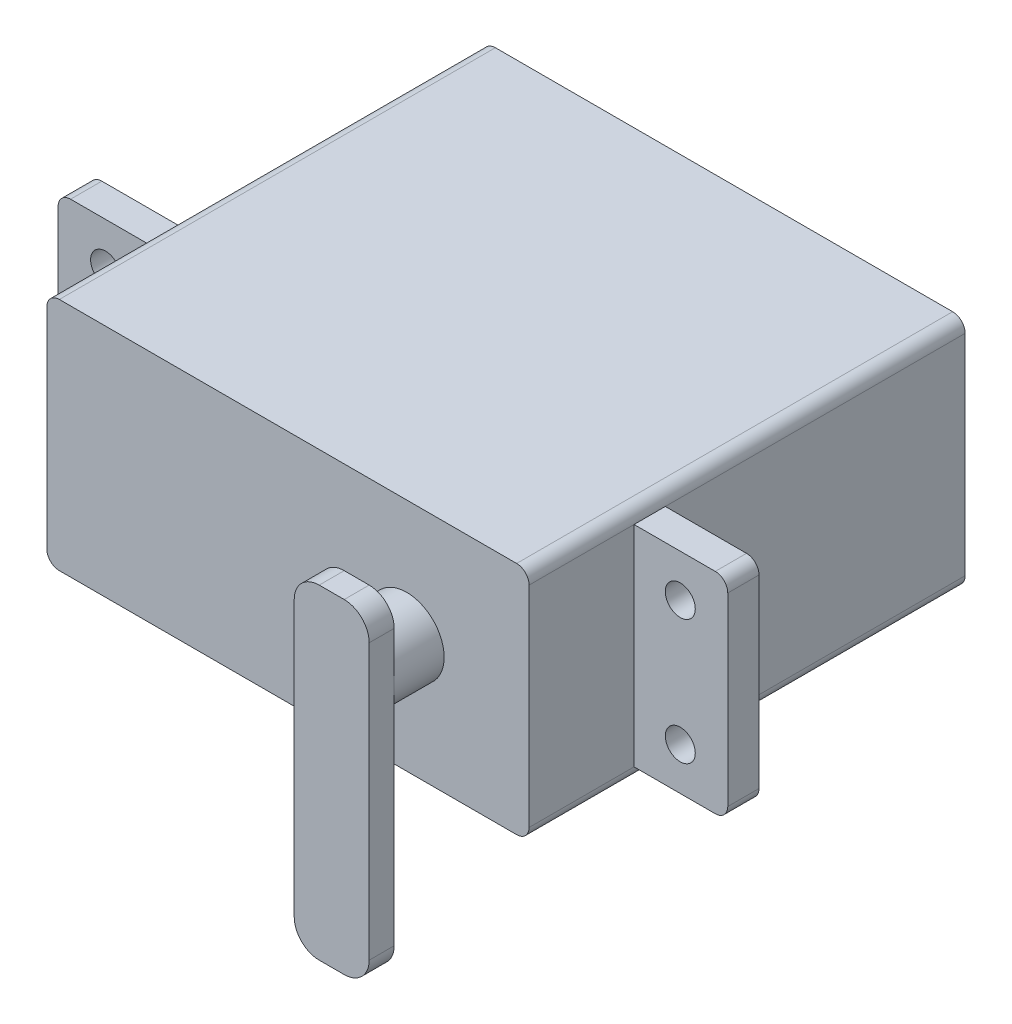
ISO-10303-21;
HEADER;
FILE_DESCRIPTION(('STEP AP214'),'2;1');
FILE_NAME('part.step','',(''),(''),'','','');
FILE_SCHEMA(('AUTOMOTIVE_DESIGN { 1 0 10303 214 1 1 1 1 }'));
ENDSEC;
DATA;
#1=APPLICATION_CONTEXT('core data for automotive mechanical design processes');
#2=APPLICATION_PROTOCOL_DEFINITION('international standard','automotive_design',2000,#1);
#3=PRODUCT_CONTEXT('',#1,'mechanical');
#4=PRODUCT('Part','Part','',(#3));
#5=PRODUCT_RELATED_PRODUCT_CATEGORY('part','',(#4));
#6=PRODUCT_DEFINITION_FORMATION('','',#4);
#7=PRODUCT_DEFINITION_CONTEXT('part definition',#1,'design');
#8=PRODUCT_DEFINITION('design','',#6,#7);
#9=PRODUCT_DEFINITION_SHAPE('','',#8);
#10=(LENGTH_UNIT() NAMED_UNIT(*) SI_UNIT(.MILLI.,.METRE.));
#11=(NAMED_UNIT(*) PLANE_ANGLE_UNIT() SI_UNIT($,.RADIAN.));
#12=(NAMED_UNIT(*) SI_UNIT($,.STERADIAN.) SOLID_ANGLE_UNIT());
#13=UNCERTAINTY_MEASURE_WITH_UNIT(LENGTH_MEASURE(1.E-05),#10,'distance_accuracy_value','');
#14=(GEOMETRIC_REPRESENTATION_CONTEXT(3) GLOBAL_UNCERTAINTY_ASSIGNED_CONTEXT((#13)) GLOBAL_UNIT_ASSIGNED_CONTEXT((#10,
#11,#12)) REPRESENTATION_CONTEXT('',''));
#15=CARTESIAN_POINT('',(0.,0.,0.));
#16=DIRECTION('',(0.,0.,1.));
#17=DIRECTION('',(1.,0.,0.));
#18=AXIS2_PLACEMENT_3D('',#15,#16,#17);
#19=CARTESIAN_POINT('',(19.3,-8.4,34.9));
#20=DIRECTION('',(-1.,0.,0.));
#21=DIRECTION('',(0.,0.,1.));
#22=AXIS2_PLACEMENT_3D('',#19,#20,#21);
#23=PLANE('',#22);
#24=DIRECTION('',(0.,1.,0.));
#25=VECTOR('',#24,1.);
#26=CARTESIAN_POINT('',(19.3,-8.4,24.));
#27=LINE('',#26,#25);
#28=CARTESIAN_POINT('',(19.3,-8.4,24.));
#29=VERTEX_POINT('',#28);
#30=CARTESIAN_POINT('',(19.3,8.4,24.));
#31=VERTEX_POINT('',#30);
#32=EDGE_CURVE('E352',#29,#31,#27,.T.);
#33=ORIENTED_EDGE('',*,*,#32,.F.);
#34=DIRECTION('',(0.,0.,-1.));
#35=VECTOR('',#34,1.);
#36=CARTESIAN_POINT('',(19.3,-8.4,34.9));
#37=LINE('',#36,#35);
#38=CARTESIAN_POINT('',(19.3,-8.4,0.));
#39=VERTEX_POINT('',#38);
#40=EDGE_CURVE('E419',#29,#39,#37,.T.);
#41=ORIENTED_EDGE('',*,*,#40,.T.);
#42=DIRECTION('',(0.,1.,0.));
#43=VECTOR('',#42,1.);
#44=CARTESIAN_POINT('',(19.3,-8.4,0.));
#45=LINE('',#44,#43);
#46=CARTESIAN_POINT('',(19.3,8.4,0.));
#47=VERTEX_POINT('',#46);
#48=EDGE_CURVE('E388',#39,#47,#45,.T.);
#49=ORIENTED_EDGE('',*,*,#48,.T.);
#50=DIRECTION('',(0.,0.,-1.));
#51=VECTOR('',#50,1.);
#52=CARTESIAN_POINT('',(19.3,8.4,34.9));
#53=LINE('',#52,#51);
#54=EDGE_CURVE('E415',#31,#47,#53,.T.);
#55=ORIENTED_EDGE('',*,*,#54,.F.);
#56=EDGE_LOOP('',(#33,#41,#49,#55));
#57=FACE_BOUND('',#56,.T.);
#58=ADVANCED_FACE('F39',(#57),#23,.F.);
#59=CARTESIAN_POINT('',(-19.3,8.4,34.9));
#60=DIRECTION('',(1.,0.,0.));
#61=DIRECTION('',(0.,0.,-1.));
#62=AXIS2_PLACEMENT_3D('',#59,#60,#61);
#63=PLANE('',#62);
#64=DIRECTION('',(0.,-1.,0.));
#65=VECTOR('',#64,1.);
#66=CARTESIAN_POINT('',(-19.3,8.4,24.));
#67=LINE('',#66,#65);
#68=CARTESIAN_POINT('',(-19.3,8.4,24.));
#69=VERTEX_POINT('',#68);
#70=CARTESIAN_POINT('',(-19.3,-8.4,24.));
#71=VERTEX_POINT('',#70);
#72=EDGE_CURVE('E47',#69,#71,#67,.T.);
#73=ORIENTED_EDGE('',*,*,#72,.F.);
#74=DIRECTION('',(0.,0.,-1.));
#75=VECTOR('',#74,1.);
#76=CARTESIAN_POINT('',(-19.3,8.4,34.9));
#77=LINE('',#76,#75);
#78=CARTESIAN_POINT('',(-19.3,8.4,0.));
#79=VERTEX_POINT('',#78);
#80=EDGE_CURVE('E403',#69,#79,#77,.T.);
#81=ORIENTED_EDGE('',*,*,#80,.T.);
#82=DIRECTION('',(0.,-1.,0.));
#83=VECTOR('',#82,1.);
#84=CARTESIAN_POINT('',(-19.3,8.4,0.));
#85=LINE('',#84,#83);
#86=CARTESIAN_POINT('',(-19.3,-8.4,0.));
#87=VERTEX_POINT('',#86);
#88=EDGE_CURVE('E366',#79,#87,#85,.T.);
#89=ORIENTED_EDGE('',*,*,#88,.T.);
#90=DIRECTION('',(0.,0.,-1.));
#91=VECTOR('',#90,1.);
#92=CARTESIAN_POINT('',(-19.3,-8.4,34.9));
#93=LINE('',#92,#91);
#94=EDGE_CURVE('E380',#71,#87,#93,.T.);
#95=ORIENTED_EDGE('',*,*,#94,.F.);
#96=EDGE_LOOP('',(#73,#81,#89,#95));
#97=FACE_BOUND('',#96,.T.);
#98=ADVANCED_FACE('F460',(#97),#63,.F.);
#99=CARTESIAN_POINT('',(-18.3,-8.4,34.9));
#100=DIRECTION('',(0.,0.,-1.));
#101=DIRECTION('',(-1.,0.,0.));
#102=AXIS2_PLACEMENT_3D('',#99,#100,#101);
#103=CYLINDRICAL_SURFACE('',#102,1.);
#104=CARTESIAN_POINT('',(-18.3,-8.4,0.));
#105=DIRECTION('',(0.,0.,1.));
#106=DIRECTION('',(1.,0.,0.));
#107=AXIS2_PLACEMENT_3D('',#104,#105,#106);
#108=CIRCLE('',#107,1.);
#109=CARTESIAN_POINT('',(-18.3,-9.4,0.));
#110=VERTEX_POINT('',#109);
#111=EDGE_CURVE('E361',#87,#110,#108,.T.);
#112=ORIENTED_EDGE('',*,*,#111,.T.);
#113=DIRECTION('',(0.,0.,-1.));
#114=VECTOR('',#113,1.);
#115=CARTESIAN_POINT('',(-18.3,-9.4,34.9));
#116=LINE('',#115,#114);
#117=CARTESIAN_POINT('',(-18.3,-9.4,34.9));
#118=VERTEX_POINT('',#117);
#119=EDGE_CURVE('E426',#118,#110,#116,.T.);
#120=ORIENTED_EDGE('',*,*,#119,.F.);
#121=CARTESIAN_POINT('',(-18.3,-8.4,34.9));
#122=DIRECTION('',(0.,0.,1.));
#123=DIRECTION('',(1.,0.,0.));
#124=AXIS2_PLACEMENT_3D('',#121,#122,#123);
#125=CIRCLE('',#124,1.);
#126=CARTESIAN_POINT('',(-19.3,-8.4,34.9));
#127=VERTEX_POINT('',#126);
#128=EDGE_CURVE('E362',#127,#118,#125,.T.);
#129=ORIENTED_EDGE('',*,*,#128,.F.);
#130=CARTESIAN_POINT('',(-19.3,-8.4,26.5));
#131=VERTEX_POINT('',#130);
#132=EDGE_CURVE('E400',#127,#131,#93,.T.);
#133=ORIENTED_EDGE('',*,*,#132,.T.);
#134=EDGE_CURVE('E404',#131,#71,#93,.T.);
#135=ORIENTED_EDGE('',*,*,#134,.T.);
#136=ORIENTED_EDGE('',*,*,#94,.T.);
#137=EDGE_LOOP('',(#112,#120,#129,#133,#135,#136));
#138=FACE_BOUND('',#137,.T.);
#139=ADVANCED_FACE('F41',(#138),#103,.T.);
#140=CARTESIAN_POINT('',(-18.3,-9.4,34.9));
#141=DIRECTION('',(0.,1.,0.));
#142=DIRECTION('',(0.,0.,1.));
#143=AXIS2_PLACEMENT_3D('',#140,#141,#142);
#144=PLANE('',#143);
#145=DIRECTION('',(1.,0.,0.));
#146=VECTOR('',#145,1.);
#147=CARTESIAN_POINT('',(-18.3,-9.4,0.));
#148=LINE('',#147,#146);
#149=CARTESIAN_POINT('',(18.3,-9.4,0.));
#150=VERTEX_POINT('',#149);
#151=EDGE_CURVE('E383',#110,#150,#148,.T.);
#152=ORIENTED_EDGE('',*,*,#151,.T.);
#153=DIRECTION('',(0.,0.,-1.));
#154=VECTOR('',#153,1.);
#155=CARTESIAN_POINT('',(18.3,-9.4,34.9));
#156=LINE('',#155,#154);
#157=CARTESIAN_POINT('',(18.3,-9.4,34.9));
#158=VERTEX_POINT('',#157);
#159=EDGE_CURVE('E423',#158,#150,#156,.T.);
#160=ORIENTED_EDGE('',*,*,#159,.F.);
#161=DIRECTION('',(1.,0.,0.));
#162=VECTOR('',#161,1.);
#163=CARTESIAN_POINT('',(-18.3,-9.4,34.9));
#164=LINE('',#163,#162);
#165=EDGE_CURVE('E365',#118,#158,#164,.T.);
#166=ORIENTED_EDGE('',*,*,#165,.F.);
#167=ORIENTED_EDGE('',*,*,#119,.T.);
#168=EDGE_LOOP('',(#152,#160,#166,#167));
#169=FACE_BOUND('',#168,.T.);
#170=ADVANCED_FACE('F521',(#169),#144,.F.);
#171=CARTESIAN_POINT('',(18.3,-8.4,34.9));
#172=DIRECTION('',(0.,0.,-1.));
#173=DIRECTION('',(-1.,0.,0.));
#174=AXIS2_PLACEMENT_3D('',#171,#172,#173);
#175=CYLINDRICAL_SURFACE('',#174,1.);
#176=CARTESIAN_POINT('',(18.3,-8.4,0.));
#177=DIRECTION('',(0.,0.,1.));
#178=DIRECTION('',(1.,0.,0.));
#179=AXIS2_PLACEMENT_3D('',#176,#177,#178);
#180=CIRCLE('',#179,1.);
#181=EDGE_CURVE('E385',#150,#39,#180,.T.);
#182=ORIENTED_EDGE('',*,*,#181,.T.);
#183=ORIENTED_EDGE('',*,*,#40,.F.);
#184=DIRECTION('',(0.,0.,-1.));
#185=VECTOR('',#184,1.);
#186=CARTESIAN_POINT('',(19.3,-8.4,34.9));
#187=LINE('',#186,#185);
#188=CARTESIAN_POINT('',(19.3,-8.4,26.5));
#189=VERTEX_POINT('',#188);
#190=EDGE_CURVE('E359',#189,#29,#187,.T.);
#191=ORIENTED_EDGE('',*,*,#190,.F.);
#192=CARTESIAN_POINT('',(19.3,-8.4,34.9));
#193=VERTEX_POINT('',#192);
#194=EDGE_CURVE('E420',#193,#189,#37,.T.);
#195=ORIENTED_EDGE('',*,*,#194,.F.);
#196=CARTESIAN_POINT('',(18.3,-8.4,34.9));
#197=DIRECTION('',(0.,0.,1.));
#198=DIRECTION('',(1.,0.,0.));
#199=AXIS2_PLACEMENT_3D('',#196,#197,#198);
#200=CIRCLE('',#199,1.);
#201=EDGE_CURVE('E368',#158,#193,#200,.T.);
#202=ORIENTED_EDGE('',*,*,#201,.F.);
#203=ORIENTED_EDGE('',*,*,#159,.T.);
#204=EDGE_LOOP('',(#182,#183,#191,#195,#202,#203));
#205=FACE_BOUND('',#204,.T.);
#206=ADVANCED_FACE('F513',(#205),#175,.T.);
#207=ORIENTED_EDGE('',*,*,#194,.T.);
#208=DIRECTION('',(0.,1.,0.));
#209=VECTOR('',#208,1.);
#210=CARTESIAN_POINT('',(19.3,-8.4,26.5));
#211=LINE('',#210,#209);
#212=CARTESIAN_POINT('',(19.3,8.4,26.5));
#213=VERTEX_POINT('',#212);
#214=EDGE_CURVE('E354',#189,#213,#211,.T.);
#215=ORIENTED_EDGE('',*,*,#214,.T.);
#216=CARTESIAN_POINT('',(19.3,8.4,34.9));
#217=VERTEX_POINT('',#216);
#218=EDGE_CURVE('E416',#217,#213,#53,.T.);
#219=ORIENTED_EDGE('',*,*,#218,.F.);
#220=DIRECTION('',(0.,1.,0.));
#221=VECTOR('',#220,1.);
#222=CARTESIAN_POINT('',(19.3,-8.4,34.9));
#223=LINE('',#222,#221);
#224=EDGE_CURVE('E370',#193,#217,#223,.T.);
#225=ORIENTED_EDGE('',*,*,#224,.F.);
#226=EDGE_LOOP('',(#207,#215,#219,#225));
#227=FACE_BOUND('',#226,.T.);
#228=ADVANCED_FACE('F502',(#227),#23,.F.);
#229=CARTESIAN_POINT('',(18.3,8.4,34.9));
#230=DIRECTION('',(0.,0.,-1.));
#231=DIRECTION('',(-1.,0.,0.));
#232=AXIS2_PLACEMENT_3D('',#229,#230,#231);
#233=CYLINDRICAL_SURFACE('',#232,1.);
#234=CARTESIAN_POINT('',(18.3,8.4,0.));
#235=DIRECTION('',(0.,0.,1.));
#236=DIRECTION('',(1.,0.,0.));
#237=AXIS2_PLACEMENT_3D('',#234,#235,#236);
#238=CIRCLE('',#237,1.);
#239=CARTESIAN_POINT('',(18.3,9.4,0.));
#240=VERTEX_POINT('',#239);
#241=EDGE_CURVE('E391',#47,#240,#238,.T.);
#242=ORIENTED_EDGE('',*,*,#241,.T.);
#243=DIRECTION('',(0.,0.,-1.));
#244=VECTOR('',#243,1.);
#245=CARTESIAN_POINT('',(18.3,9.4,34.9));
#246=LINE('',#245,#244);
#247=CARTESIAN_POINT('',(18.3,9.4,34.9));
#248=VERTEX_POINT('',#247);
#249=EDGE_CURVE('E412',#248,#240,#246,.T.);
#250=ORIENTED_EDGE('',*,*,#249,.F.);
#251=CARTESIAN_POINT('',(18.3,8.4,34.9));
#252=DIRECTION('',(0.,0.,1.));
#253=DIRECTION('',(1.,0.,0.));
#254=AXIS2_PLACEMENT_3D('',#251,#252,#253);
#255=CIRCLE('',#254,1.);
#256=EDGE_CURVE('E372',#217,#248,#255,.T.);
#257=ORIENTED_EDGE('',*,*,#256,.F.);
#258=ORIENTED_EDGE('',*,*,#218,.T.);
#259=DIRECTION('',(0.,0.,-1.));
#260=VECTOR('',#259,1.);
#261=CARTESIAN_POINT('',(19.3,8.4,34.9));
#262=LINE('',#261,#260);
#263=EDGE_CURVE('E357',#31,#213,#262,.F.);
#264=ORIENTED_EDGE('',*,*,#263,.F.);
#265=ORIENTED_EDGE('',*,*,#54,.T.);
#266=EDGE_LOOP('',(#242,#250,#257,#258,#264,#265));
#267=FACE_BOUND('',#266,.T.);
#268=ADVANCED_FACE('F512',(#267),#233,.T.);
#269=CARTESIAN_POINT('',(18.3,9.4,34.9));
#270=DIRECTION('',(0.,-1.,0.));
#271=DIRECTION('',(0.,0.,-1.));
#272=AXIS2_PLACEMENT_3D('',#269,#270,#271);
#273=PLANE('',#272);
#274=DIRECTION('',(-1.,0.,0.));
#275=VECTOR('',#274,1.);
#276=CARTESIAN_POINT('',(18.3,9.4,0.));
#277=LINE('',#276,#275);
#278=CARTESIAN_POINT('',(-18.3,9.4,0.));
#279=VERTEX_POINT('',#278);
#280=EDGE_CURVE('E393',#240,#279,#277,.T.);
#281=ORIENTED_EDGE('',*,*,#280,.T.);
#282=DIRECTION('',(0.,0.,-1.));
#283=VECTOR('',#282,1.);
#284=CARTESIAN_POINT('',(-18.3,9.4,34.9));
#285=LINE('',#284,#283);
#286=CARTESIAN_POINT('',(-18.3,9.4,34.9));
#287=VERTEX_POINT('',#286);
#288=EDGE_CURVE('E408',#287,#279,#285,.T.);
#289=ORIENTED_EDGE('',*,*,#288,.F.);
#290=DIRECTION('',(-1.,0.,0.));
#291=VECTOR('',#290,1.);
#292=CARTESIAN_POINT('',(18.3,9.4,34.9));
#293=LINE('',#292,#291);
#294=EDGE_CURVE('E374',#248,#287,#293,.T.);
#295=ORIENTED_EDGE('',*,*,#294,.F.);
#296=ORIENTED_EDGE('',*,*,#249,.T.);
#297=EDGE_LOOP('',(#281,#289,#295,#296));
#298=FACE_BOUND('',#297,.T.);
#299=ADVANCED_FACE('F519',(#298),#273,.F.);
#300=CARTESIAN_POINT('',(-18.3,8.4,34.9));
#301=DIRECTION('',(0.,0.,-1.));
#302=DIRECTION('',(-1.,0.,0.));
#303=AXIS2_PLACEMENT_3D('',#300,#301,#302);
#304=CYLINDRICAL_SURFACE('',#303,1.);
#305=CARTESIAN_POINT('',(-18.3,8.4,0.));
#306=DIRECTION('',(0.,0.,1.));
#307=DIRECTION('',(1.,0.,0.));
#308=AXIS2_PLACEMENT_3D('',#305,#306,#307);
#309=CIRCLE('',#308,1.);
#310=EDGE_CURVE('E395',#279,#79,#309,.T.);
#311=ORIENTED_EDGE('',*,*,#310,.T.);
#312=ORIENTED_EDGE('',*,*,#80,.F.);
#313=CARTESIAN_POINT('',(-19.3,8.4,26.5));
#314=VERTEX_POINT('',#313);
#315=EDGE_CURVE('E409',#314,#69,#77,.T.);
#316=ORIENTED_EDGE('',*,*,#315,.F.);
#317=CARTESIAN_POINT('',(-19.3,8.4,34.9));
#318=VERTEX_POINT('',#317);
#319=EDGE_CURVE('E405',#318,#314,#77,.T.);
#320=ORIENTED_EDGE('',*,*,#319,.F.);
#321=CARTESIAN_POINT('',(-18.3,8.4,34.9));
#322=DIRECTION('',(0.,0.,1.));
#323=DIRECTION('',(1.,0.,0.));
#324=AXIS2_PLACEMENT_3D('',#321,#322,#323);
#325=CIRCLE('',#324,1.);
#326=EDGE_CURVE('E376',#287,#318,#325,.T.);
#327=ORIENTED_EDGE('',*,*,#326,.F.);
#328=ORIENTED_EDGE('',*,*,#288,.T.);
#329=EDGE_LOOP('',(#311,#312,#316,#320,#327,#328));
#330=FACE_BOUND('',#329,.T.);
#331=ADVANCED_FACE('F464',(#330),#304,.T.);
#332=ORIENTED_EDGE('',*,*,#319,.T.);
#333=DIRECTION('',(0.,-1.,0.));
#334=VECTOR('',#333,1.);
#335=CARTESIAN_POINT('',(-19.3,8.4,26.5));
#336=LINE('',#335,#334);
#337=EDGE_CURVE('E11',#314,#131,#336,.T.);
#338=ORIENTED_EDGE('',*,*,#337,.T.);
#339=ORIENTED_EDGE('',*,*,#132,.F.);
#340=DIRECTION('',(0.,-1.,0.));
#341=VECTOR('',#340,1.);
#342=CARTESIAN_POINT('',(-19.3,8.4,34.9));
#343=LINE('',#342,#341);
#344=EDGE_CURVE('E378',#318,#127,#343,.T.);
#345=ORIENTED_EDGE('',*,*,#344,.F.);
#346=EDGE_LOOP('',(#332,#338,#339,#345));
#347=FACE_BOUND('',#346,.T.);
#348=ADVANCED_FACE('F477',(#347),#63,.F.);
#349=CARTESIAN_POINT('',(-18.3,-8.4,34.9));
#350=DIRECTION('',(0.,0.,1.));
#351=DIRECTION('',(1.,0.,0.));
#352=AXIS2_PLACEMENT_3D('',#349,#350,#351);
#353=PLANE('',#352);
#354=CARTESIAN_POINT('',(9.5,0.,34.9));
#355=DIRECTION('',(0.,0.,1.));
#356=DIRECTION('',(1.,0.,0.));
#357=AXIS2_PLACEMENT_3D('',#354,#355,#356);
#358=CIRCLE('',#357,3.);
#359=CARTESIAN_POINT('',(12.5,0.,34.9));
#360=VERTEX_POINT('',#359);
#361=EDGE_CURVE('E255',#360,#360,#358,.T.);
#362=ORIENTED_EDGE('',*,*,#361,.F.);
#363=EDGE_LOOP('',(#362));
#364=FACE_BOUND('',#363,.T.);
#365=ORIENTED_EDGE('',*,*,#128,.T.);
#366=ORIENTED_EDGE('',*,*,#165,.T.);
#367=ORIENTED_EDGE('',*,*,#201,.T.);
#368=ORIENTED_EDGE('',*,*,#224,.T.);
#369=ORIENTED_EDGE('',*,*,#256,.T.);
#370=ORIENTED_EDGE('',*,*,#294,.T.);
#371=ORIENTED_EDGE('',*,*,#326,.T.);
#372=ORIENTED_EDGE('',*,*,#344,.T.);
#373=EDGE_LOOP('',(#365,#366,#367,#368,#369,#370,#371,#372));
#374=FACE_BOUND('',#373,.T.);
#375=ADVANCED_FACE('F572',(#364,#374),#353,.T.);
#376=CARTESIAN_POINT('',(-18.3,-8.4,0.));
#377=DIRECTION('',(0.,0.,1.));
#378=DIRECTION('',(1.,0.,0.));
#379=AXIS2_PLACEMENT_3D('',#376,#377,#378);
#380=PLANE('',#379);
#381=ORIENTED_EDGE('',*,*,#111,.F.);
#382=ORIENTED_EDGE('',*,*,#88,.F.);
#383=ORIENTED_EDGE('',*,*,#310,.F.);
#384=ORIENTED_EDGE('',*,*,#280,.F.);
#385=ORIENTED_EDGE('',*,*,#241,.F.);
#386=ORIENTED_EDGE('',*,*,#48,.F.);
#387=ORIENTED_EDGE('',*,*,#181,.F.);
#388=ORIENTED_EDGE('',*,*,#151,.F.);
#389=EDGE_LOOP('',(#381,#382,#383,#384,#385,#386,#387,#388));
#390=FACE_BOUND('',#389,.T.);
#391=ADVANCED_FACE('F469',(#390),#380,.F.);
#392=CARTESIAN_POINT('',(-25.8,7.4,26.5));
#393=DIRECTION('',(0.,0.,-1.));
#394=DIRECTION('',(-1.,0.,0.));
#395=AXIS2_PLACEMENT_3D('',#392,#393,#394);
#396=CYLINDRICAL_SURFACE('',#395,1.);
#397=CARTESIAN_POINT('',(-25.8,7.4,24.));
#398=DIRECTION('',(0.,0.,1.));
#399=DIRECTION('',(1.,0.,0.));
#400=AXIS2_PLACEMENT_3D('',#397,#398,#399);
#401=CIRCLE('',#400,1.);
#402=CARTESIAN_POINT('',(-25.8,8.4,24.));
#403=VERTEX_POINT('',#402);
#404=CARTESIAN_POINT('',(-26.8,7.4,24.));
#405=VERTEX_POINT('',#404);
#406=EDGE_CURVE('E327',#403,#405,#401,.T.);
#407=ORIENTED_EDGE('',*,*,#406,.T.);
#408=DIRECTION('',(0.,0.,-1.));
#409=VECTOR('',#408,1.);
#410=CARTESIAN_POINT('',(-26.8,7.4,26.5));
#411=LINE('',#410,#409);
#412=CARTESIAN_POINT('',(-26.8,7.4,26.5));
#413=VERTEX_POINT('',#412);
#414=EDGE_CURVE('E332',#413,#405,#411,.T.);
#415=ORIENTED_EDGE('',*,*,#414,.F.);
#416=CARTESIAN_POINT('',(-25.8,7.4,26.5));
#417=DIRECTION('',(0.,0.,1.));
#418=DIRECTION('',(1.,0.,0.));
#419=AXIS2_PLACEMENT_3D('',#416,#417,#418);
#420=CIRCLE('',#419,1.);
#421=CARTESIAN_POINT('',(-25.8,8.4,26.5));
#422=VERTEX_POINT('',#421);
#423=EDGE_CURVE('E308',#422,#413,#420,.T.);
#424=ORIENTED_EDGE('',*,*,#423,.F.);
#425=DIRECTION('',(0.,0.,-1.));
#426=VECTOR('',#425,1.);
#427=CARTESIAN_POINT('',(-25.8,8.4,26.5));
#428=LINE('',#427,#426);
#429=EDGE_CURVE('E335',#422,#403,#428,.T.);
#430=ORIENTED_EDGE('',*,*,#429,.T.);
#431=EDGE_LOOP('',(#407,#415,#424,#430));
#432=FACE_BOUND('',#431,.T.);
#433=ADVANCED_FACE('F452',(#432),#396,.T.);
#434=CARTESIAN_POINT('',(-26.8,7.4,26.5));
#435=DIRECTION('',(1.,0.,0.));
#436=DIRECTION('',(0.,0.,-1.));
#437=AXIS2_PLACEMENT_3D('',#434,#435,#436);
#438=PLANE('',#437);
#439=DIRECTION('',(0.,-1.,0.));
#440=VECTOR('',#439,1.);
#441=CARTESIAN_POINT('',(-26.8,7.4,24.));
#442=LINE('',#441,#440);
#443=CARTESIAN_POINT('',(-26.8,-7.4,24.));
#444=VERTEX_POINT('',#443);
#445=EDGE_CURVE('E294',#405,#444,#442,.T.);
#446=ORIENTED_EDGE('',*,*,#445,.T.);
#447=DIRECTION('',(0.,0.,-1.));
#448=VECTOR('',#447,1.);
#449=CARTESIAN_POINT('',(-26.8,-7.4,26.5));
#450=LINE('',#449,#448);
#451=CARTESIAN_POINT('',(-26.8,-7.4,26.5));
#452=VERTEX_POINT('',#451);
#453=EDGE_CURVE('E312',#452,#444,#450,.T.);
#454=ORIENTED_EDGE('',*,*,#453,.F.);
#455=DIRECTION('',(0.,-1.,0.));
#456=VECTOR('',#455,1.);
#457=CARTESIAN_POINT('',(-26.8,7.4,26.5));
#458=LINE('',#457,#456);
#459=EDGE_CURVE('E310',#413,#452,#458,.T.);
#460=ORIENTED_EDGE('',*,*,#459,.F.);
#461=ORIENTED_EDGE('',*,*,#414,.T.);
#462=EDGE_LOOP('',(#446,#454,#460,#461));
#463=FACE_BOUND('',#462,.T.);
#464=ADVANCED_FACE('F447',(#463),#438,.F.);
#465=CARTESIAN_POINT('',(-25.8,-7.4,26.5));
#466=DIRECTION('',(0.,0.,-1.));
#467=DIRECTION('',(-1.,0.,0.));
#468=AXIS2_PLACEMENT_3D('',#465,#466,#467);
#469=CYLINDRICAL_SURFACE('',#468,1.);
#470=CARTESIAN_POINT('',(-25.8,-7.4,24.));
#471=DIRECTION('',(0.,0.,1.));
#472=DIRECTION('',(1.,0.,0.));
#473=AXIS2_PLACEMENT_3D('',#470,#471,#472);
#474=CIRCLE('',#473,1.);
#475=CARTESIAN_POINT('',(-25.8,-8.4,24.));
#476=VERTEX_POINT('',#475);
#477=EDGE_CURVE('E287',#444,#476,#474,.T.);
#478=ORIENTED_EDGE('',*,*,#477,.T.);
#479=DIRECTION('',(0.,0.,-1.));
#480=VECTOR('',#479,1.);
#481=CARTESIAN_POINT('',(-25.8,-8.4,26.5));
#482=LINE('',#481,#480);
#483=CARTESIAN_POINT('',(-25.8,-8.4,26.5));
#484=VERTEX_POINT('',#483);
#485=EDGE_CURVE('E349',#484,#476,#482,.T.);
#486=ORIENTED_EDGE('',*,*,#485,.F.);
#487=CARTESIAN_POINT('',(-25.8,-7.4,26.5));
#488=DIRECTION('',(0.,0.,1.));
#489=DIRECTION('',(1.,0.,0.));
#490=AXIS2_PLACEMENT_3D('',#487,#488,#489);
#491=CIRCLE('',#490,1.);
#492=EDGE_CURVE('E290',#452,#484,#491,.T.);
#493=ORIENTED_EDGE('',*,*,#492,.F.);
#494=ORIENTED_EDGE('',*,*,#453,.T.);
#495=EDGE_LOOP('',(#478,#486,#493,#494));
#496=FACE_BOUND('',#495,.T.);
#497=ADVANCED_FACE('F443',(#496),#469,.T.);
#498=CARTESIAN_POINT('',(-25.8,-7.4,24.));
#499=DIRECTION('',(0.,0.,1.));
#500=DIRECTION('',(1.,0.,0.));
#501=AXIS2_PLACEMENT_3D('',#498,#499,#500);
#502=PLANE('',#501);
#503=CARTESIAN_POINT('',(-23.,5.,24.));
#504=DIRECTION('',(0.,0.,1.));
#505=DIRECTION('',(1.,0.,0.));
#506=AXIS2_PLACEMENT_3D('',#503,#504,#505);
#507=CIRCLE('',#506,1.2);
#508=CARTESIAN_POINT('',(-21.8,5.,24.));
#509=VERTEX_POINT('',#508);
#510=EDGE_CURVE('E279',#509,#509,#507,.T.);
#511=ORIENTED_EDGE('',*,*,#510,.T.);
#512=EDGE_LOOP('',(#511));
#513=FACE_BOUND('',#512,.T.);
#514=CARTESIAN_POINT('',(-23.,-5.,24.));
#515=DIRECTION('',(0.,0.,1.));
#516=DIRECTION('',(1.,0.,0.));
#517=AXIS2_PLACEMENT_3D('',#514,#515,#516);
#518=CIRCLE('',#517,1.2);
#519=CARTESIAN_POINT('',(-21.8,-5.,24.));
#520=VERTEX_POINT('',#519);
#521=EDGE_CURVE('E266',#520,#520,#518,.T.);
#522=ORIENTED_EDGE('',*,*,#521,.T.);
#523=EDGE_LOOP('',(#522));
#524=FACE_BOUND('',#523,.T.);
#525=DIRECTION('',(-1.,0.,0.));
#526=VECTOR('',#525,1.);
#527=CARTESIAN_POINT('',(25.8,8.4,24.));
#528=LINE('',#527,#526);
#529=EDGE_CURVE('E325',#69,#403,#528,.T.);
#530=ORIENTED_EDGE('',*,*,#529,.F.);
#531=ORIENTED_EDGE('',*,*,#72,.T.);
#532=DIRECTION('',(1.,0.,0.));
#533=VECTOR('',#532,1.);
#534=CARTESIAN_POINT('',(-25.8,-8.4,24.));
#535=LINE('',#534,#533);
#536=EDGE_CURVE('E316',#476,#71,#535,.T.);
#537=ORIENTED_EDGE('',*,*,#536,.F.);
#538=ORIENTED_EDGE('',*,*,#477,.F.);
#539=ORIENTED_EDGE('',*,*,#445,.F.);
#540=ORIENTED_EDGE('',*,*,#406,.F.);
#541=EDGE_LOOP('',(#530,#531,#537,#538,#539,#540));
#542=FACE_BOUND('',#541,.T.);
#543=ADVANCED_FACE('F431',(#513,#524,#542),#502,.F.);
#544=CARTESIAN_POINT('',(-25.8,-7.4,26.5));
#545=DIRECTION('',(0.,0.,1.));
#546=DIRECTION('',(1.,0.,0.));
#547=AXIS2_PLACEMENT_3D('',#544,#545,#546);
#548=PLANE('',#547);
#549=CARTESIAN_POINT('',(-23.,5.,26.5));
#550=DIRECTION('',(0.,0.,1.));
#551=DIRECTION('',(1.,0.,0.));
#552=AXIS2_PLACEMENT_3D('',#549,#550,#551);
#553=CIRCLE('',#552,1.2);
#554=CARTESIAN_POINT('',(-21.8,5.,26.5));
#555=VERTEX_POINT('',#554);
#556=EDGE_CURVE('E269',#555,#555,#553,.T.);
#557=ORIENTED_EDGE('',*,*,#556,.F.);
#558=EDGE_LOOP('',(#557));
#559=FACE_BOUND('',#558,.T.);
#560=CARTESIAN_POINT('',(-23.,-5.,26.5));
#561=DIRECTION('',(0.,0.,1.));
#562=DIRECTION('',(1.,0.,0.));
#563=AXIS2_PLACEMENT_3D('',#560,#561,#562);
#564=CIRCLE('',#563,1.2);
#565=CARTESIAN_POINT('',(-21.8,-5.,26.5));
#566=VERTEX_POINT('',#565);
#567=EDGE_CURVE('E264',#566,#566,#564,.T.);
#568=ORIENTED_EDGE('',*,*,#567,.F.);
#569=EDGE_LOOP('',(#568));
#570=FACE_BOUND('',#569,.T.);
#571=ORIENTED_EDGE('',*,*,#337,.F.);
#572=DIRECTION('',(-1.,0.,0.));
#573=VECTOR('',#572,1.);
#574=CARTESIAN_POINT('',(25.8,8.4,26.5));
#575=LINE('',#574,#573);
#576=EDGE_CURVE('E304',#314,#422,#575,.T.);
#577=ORIENTED_EDGE('',*,*,#576,.T.);
#578=ORIENTED_EDGE('',*,*,#423,.T.);
#579=ORIENTED_EDGE('',*,*,#459,.T.);
#580=ORIENTED_EDGE('',*,*,#492,.T.);
#581=DIRECTION('',(1.,0.,0.));
#582=VECTOR('',#581,1.);
#583=CARTESIAN_POINT('',(-25.8,-8.4,26.5));
#584=LINE('',#583,#582);
#585=EDGE_CURVE('E295',#484,#131,#584,.T.);
#586=ORIENTED_EDGE('',*,*,#585,.T.);
#587=EDGE_LOOP('',(#571,#577,#578,#579,#580,#586));
#588=FACE_BOUND('',#587,.T.);
#589=ADVANCED_FACE('F480',(#559,#570,#588),#548,.T.);
#590=CARTESIAN_POINT('',(25.8,8.4,26.5));
#591=DIRECTION('',(0.,-1.,0.));
#592=DIRECTION('',(0.,0.,-1.));
#593=AXIS2_PLACEMENT_3D('',#590,#591,#592);
#594=PLANE('',#593);
#595=ORIENTED_EDGE('',*,*,#576,.F.);
#596=ORIENTED_EDGE('',*,*,#315,.T.);
#597=ORIENTED_EDGE('',*,*,#529,.T.);
#598=ORIENTED_EDGE('',*,*,#429,.F.);
#599=EDGE_LOOP('',(#595,#596,#597,#598));
#600=FACE_BOUND('',#599,.T.);
#601=ADVANCED_FACE('F456',(#600),#594,.F.);
#602=CARTESIAN_POINT('',(-25.8,-8.4,26.5));
#603=DIRECTION('',(0.,1.,0.));
#604=DIRECTION('',(0.,0.,1.));
#605=AXIS2_PLACEMENT_3D('',#602,#603,#604);
#606=PLANE('',#605);
#607=ORIENTED_EDGE('',*,*,#536,.T.);
#608=ORIENTED_EDGE('',*,*,#134,.F.);
#609=ORIENTED_EDGE('',*,*,#585,.F.);
#610=ORIENTED_EDGE('',*,*,#485,.T.);
#611=EDGE_LOOP('',(#607,#608,#609,#610));
#612=FACE_BOUND('',#611,.T.);
#613=ADVANCED_FACE('F439',(#612),#606,.F.);
#614=CARTESIAN_POINT('',(25.8,-8.4,26.5));
#615=VERTEX_POINT('',#614);
#616=EDGE_CURVE('E293',#189,#615,#584,.T.);
#617=ORIENTED_EDGE('',*,*,#616,.F.);
#618=ORIENTED_EDGE('',*,*,#190,.T.);
#619=CARTESIAN_POINT('',(25.8,-8.4,24.));
#620=VERTEX_POINT('',#619);
#621=EDGE_CURVE('E315',#29,#620,#535,.T.);
#622=ORIENTED_EDGE('',*,*,#621,.T.);
#623=DIRECTION('',(0.,0.,-1.));
#624=VECTOR('',#623,1.);
#625=CARTESIAN_POINT('',(25.8,-8.4,26.5));
#626=LINE('',#625,#624);
#627=EDGE_CURVE('E346',#615,#620,#626,.T.);
#628=ORIENTED_EDGE('',*,*,#627,.F.);
#629=EDGE_LOOP('',(#617,#618,#622,#628));
#630=FACE_BOUND('',#629,.T.);
#631=ADVANCED_FACE('F532',(#630),#606,.F.);
#632=CARTESIAN_POINT('',(25.8,8.4,24.));
#633=VERTEX_POINT('',#632);
#634=EDGE_CURVE('E61',#633,#31,#528,.T.);
#635=ORIENTED_EDGE('',*,*,#634,.T.);
#636=ORIENTED_EDGE('',*,*,#263,.T.);
#637=CARTESIAN_POINT('',(25.8,8.4,26.5));
#638=VERTEX_POINT('',#637);
#639=EDGE_CURVE('E305',#638,#213,#575,.T.);
#640=ORIENTED_EDGE('',*,*,#639,.F.);
#641=DIRECTION('',(0.,0.,-1.));
#642=VECTOR('',#641,1.);
#643=CARTESIAN_POINT('',(25.8,8.4,26.5));
#644=LINE('',#643,#642);
#645=EDGE_CURVE('E338',#638,#633,#644,.T.);
#646=ORIENTED_EDGE('',*,*,#645,.T.);
#647=EDGE_LOOP('',(#635,#636,#640,#646));
#648=FACE_BOUND('',#647,.T.);
#649=ADVANCED_FACE('F491',(#648),#594,.F.);
#650=CARTESIAN_POINT('',(23.,-5.,26.5));
#651=DIRECTION('',(0.,0.,1.));
#652=DIRECTION('',(1.,0.,0.));
#653=AXIS2_PLACEMENT_3D('',#650,#651,#652);
#654=CIRCLE('',#653,1.2);
#655=CARTESIAN_POINT('',(24.2,-5.,26.5));
#656=VERTEX_POINT('',#655);
#657=EDGE_CURVE('E276',#656,#656,#654,.T.);
#658=ORIENTED_EDGE('',*,*,#657,.F.);
#659=EDGE_LOOP('',(#658));
#660=FACE_BOUND('',#659,.T.);
#661=CARTESIAN_POINT('',(23.,5.,26.5));
#662=DIRECTION('',(0.,0.,1.));
#663=DIRECTION('',(1.,0.,0.));
#664=AXIS2_PLACEMENT_3D('',#661,#662,#663);
#665=CIRCLE('',#664,1.2);
#666=CARTESIAN_POINT('',(24.2,5.,26.5));
#667=VERTEX_POINT('',#666);
#668=EDGE_CURVE('E284',#667,#667,#665,.T.);
#669=ORIENTED_EDGE('',*,*,#668,.F.);
#670=EDGE_LOOP('',(#669));
#671=FACE_BOUND('',#670,.T.);
#672=ORIENTED_EDGE('',*,*,#214,.F.);
#673=ORIENTED_EDGE('',*,*,#616,.T.);
#674=CARTESIAN_POINT('',(25.8,-7.4,26.5));
#675=DIRECTION('',(0.,0.,1.));
#676=DIRECTION('',(1.,0.,0.));
#677=AXIS2_PLACEMENT_3D('',#674,#675,#676);
#678=CIRCLE('',#677,1.);
#679=CARTESIAN_POINT('',(26.8,-7.4,26.5));
#680=VERTEX_POINT('',#679);
#681=EDGE_CURVE('E298',#615,#680,#678,.T.);
#682=ORIENTED_EDGE('',*,*,#681,.T.);
#683=DIRECTION('',(0.,1.,0.));
#684=VECTOR('',#683,1.);
#685=CARTESIAN_POINT('',(26.8,-7.4,26.5));
#686=LINE('',#685,#684);
#687=CARTESIAN_POINT('',(26.8,7.4,26.5));
#688=VERTEX_POINT('',#687);
#689=EDGE_CURVE('E300',#680,#688,#686,.T.);
#690=ORIENTED_EDGE('',*,*,#689,.T.);
#691=CARTESIAN_POINT('',(25.8,7.4,26.5));
#692=DIRECTION('',(0.,0.,1.));
#693=DIRECTION('',(1.,0.,0.));
#694=AXIS2_PLACEMENT_3D('',#691,#692,#693);
#695=CIRCLE('',#694,1.);
#696=EDGE_CURVE('E302',#688,#638,#695,.T.);
#697=ORIENTED_EDGE('',*,*,#696,.T.);
#698=ORIENTED_EDGE('',*,*,#639,.T.);
#699=EDGE_LOOP('',(#672,#673,#682,#690,#697,#698));
#700=FACE_BOUND('',#699,.T.);
#701=ADVANCED_FACE('F484',(#660,#671,#700),#548,.T.);
#702=CARTESIAN_POINT('',(23.,-5.,24.));
#703=DIRECTION('',(0.,0.,1.));
#704=DIRECTION('',(1.,0.,0.));
#705=AXIS2_PLACEMENT_3D('',#702,#703,#704);
#706=CIRCLE('',#705,1.2);
#707=CARTESIAN_POINT('',(24.2,-5.,24.));
#708=VERTEX_POINT('',#707);
#709=EDGE_CURVE('E272',#708,#708,#706,.T.);
#710=ORIENTED_EDGE('',*,*,#709,.T.);
#711=EDGE_LOOP('',(#710));
#712=FACE_BOUND('',#711,.T.);
#713=CARTESIAN_POINT('',(23.,5.,24.));
#714=DIRECTION('',(0.,0.,1.));
#715=DIRECTION('',(1.,0.,0.));
#716=AXIS2_PLACEMENT_3D('',#713,#714,#715);
#717=CIRCLE('',#716,1.2);
#718=CARTESIAN_POINT('',(24.2,5.,24.));
#719=VERTEX_POINT('',#718);
#720=EDGE_CURVE('E275',#719,#719,#717,.T.);
#721=ORIENTED_EDGE('',*,*,#720,.T.);
#722=EDGE_LOOP('',(#721));
#723=FACE_BOUND('',#722,.T.);
#724=ORIENTED_EDGE('',*,*,#621,.F.);
#725=ORIENTED_EDGE('',*,*,#32,.T.);
#726=ORIENTED_EDGE('',*,*,#634,.F.);
#727=CARTESIAN_POINT('',(25.8,7.4,24.));
#728=DIRECTION('',(0.,0.,1.));
#729=DIRECTION('',(1.,0.,0.));
#730=AXIS2_PLACEMENT_3D('',#727,#728,#729);
#731=CIRCLE('',#730,1.);
#732=CARTESIAN_POINT('',(26.8,7.4,24.));
#733=VERTEX_POINT('',#732);
#734=EDGE_CURVE('E323',#733,#633,#731,.T.);
#735=ORIENTED_EDGE('',*,*,#734,.F.);
#736=DIRECTION('',(0.,1.,0.));
#737=VECTOR('',#736,1.);
#738=CARTESIAN_POINT('',(26.8,-7.4,24.));
#739=LINE('',#738,#737);
#740=CARTESIAN_POINT('',(26.8,-7.4,24.));
#741=VERTEX_POINT('',#740);
#742=EDGE_CURVE('E321',#741,#733,#739,.T.);
#743=ORIENTED_EDGE('',*,*,#742,.F.);
#744=CARTESIAN_POINT('',(25.8,-7.4,24.));
#745=DIRECTION('',(0.,0.,1.));
#746=DIRECTION('',(1.,0.,0.));
#747=AXIS2_PLACEMENT_3D('',#744,#745,#746);
#748=CIRCLE('',#747,1.);
#749=EDGE_CURVE('E319',#620,#741,#748,.T.);
#750=ORIENTED_EDGE('',*,*,#749,.F.);
#751=EDGE_LOOP('',(#724,#725,#726,#735,#743,#750));
#752=FACE_BOUND('',#751,.T.);
#753=ADVANCED_FACE('F494',(#712,#723,#752),#502,.F.);
#754=CARTESIAN_POINT('',(25.8,-7.4,26.5));
#755=DIRECTION('',(0.,0.,-1.));
#756=DIRECTION('',(-1.,0.,0.));
#757=AXIS2_PLACEMENT_3D('',#754,#755,#756);
#758=CYLINDRICAL_SURFACE('',#757,1.);
#759=ORIENTED_EDGE('',*,*,#749,.T.);
#760=DIRECTION('',(0.,0.,-1.));
#761=VECTOR('',#760,1.);
#762=CARTESIAN_POINT('',(26.8,-7.4,26.5));
#763=LINE('',#762,#761);
#764=EDGE_CURVE('E343',#680,#741,#763,.T.);
#765=ORIENTED_EDGE('',*,*,#764,.F.);
#766=ORIENTED_EDGE('',*,*,#681,.F.);
#767=ORIENTED_EDGE('',*,*,#627,.T.);
#768=EDGE_LOOP('',(#759,#765,#766,#767));
#769=FACE_BOUND('',#768,.T.);
#770=ADVANCED_FACE('F556',(#769),#758,.T.);
#771=CARTESIAN_POINT('',(26.8,-7.4,26.5));
#772=DIRECTION('',(-1.,0.,0.));
#773=DIRECTION('',(0.,0.,1.));
#774=AXIS2_PLACEMENT_3D('',#771,#772,#773);
#775=PLANE('',#774);
#776=ORIENTED_EDGE('',*,*,#742,.T.);
#777=DIRECTION('',(0.,0.,-1.));
#778=VECTOR('',#777,1.);
#779=CARTESIAN_POINT('',(26.8,7.4,26.5));
#780=LINE('',#779,#778);
#781=EDGE_CURVE('E340',#688,#733,#780,.T.);
#782=ORIENTED_EDGE('',*,*,#781,.F.);
#783=ORIENTED_EDGE('',*,*,#689,.F.);
#784=ORIENTED_EDGE('',*,*,#764,.T.);
#785=EDGE_LOOP('',(#776,#782,#783,#784));
#786=FACE_BOUND('',#785,.T.);
#787=ADVANCED_FACE('F552',(#786),#775,.F.);
#788=CARTESIAN_POINT('',(25.8,7.4,26.5));
#789=DIRECTION('',(0.,0.,-1.));
#790=DIRECTION('',(-1.,0.,0.));
#791=AXIS2_PLACEMENT_3D('',#788,#789,#790);
#792=CYLINDRICAL_SURFACE('',#791,1.);
#793=ORIENTED_EDGE('',*,*,#734,.T.);
#794=ORIENTED_EDGE('',*,*,#645,.F.);
#795=ORIENTED_EDGE('',*,*,#696,.F.);
#796=ORIENTED_EDGE('',*,*,#781,.T.);
#797=EDGE_LOOP('',(#793,#794,#795,#796));
#798=FACE_BOUND('',#797,.T.);
#799=ADVANCED_FACE('F549',(#798),#792,.T.);
#800=CARTESIAN_POINT('',(23.,5.,26.5));
#801=DIRECTION('',(0.,0.,-1.));
#802=DIRECTION('',(-1.,0.,0.));
#803=AXIS2_PLACEMENT_3D('',#800,#801,#802);
#804=CYLINDRICAL_SURFACE('',#803,1.2);
#805=ORIENTED_EDGE('',*,*,#668,.T.);
#806=EDGE_LOOP('',(#805));
#807=FACE_BOUND('',#806,.T.);
#808=ORIENTED_EDGE('',*,*,#720,.F.);
#809=EDGE_LOOP('',(#808));
#810=FACE_BOUND('',#809,.T.);
#811=ADVANCED_FACE('F743',(#807,#810),#804,.F.);
#812=CARTESIAN_POINT('',(23.,-5.,26.5));
#813=DIRECTION('',(0.,0.,-1.));
#814=DIRECTION('',(-1.,0.,0.));
#815=AXIS2_PLACEMENT_3D('',#812,#813,#814);
#816=CYLINDRICAL_SURFACE('',#815,1.2);
#817=ORIENTED_EDGE('',*,*,#657,.T.);
#818=EDGE_LOOP('',(#817));
#819=FACE_BOUND('',#818,.T.);
#820=ORIENTED_EDGE('',*,*,#709,.F.);
#821=EDGE_LOOP('',(#820));
#822=FACE_BOUND('',#821,.T.);
#823=ADVANCED_FACE('F750',(#819,#822),#816,.F.);
#824=CARTESIAN_POINT('',(-23.,-5.,26.5));
#825=DIRECTION('',(0.,0.,-1.));
#826=DIRECTION('',(-1.,0.,0.));
#827=AXIS2_PLACEMENT_3D('',#824,#825,#826);
#828=CYLINDRICAL_SURFACE('',#827,1.2);
#829=ORIENTED_EDGE('',*,*,#567,.T.);
#830=EDGE_LOOP('',(#829));
#831=FACE_BOUND('',#830,.T.);
#832=ORIENTED_EDGE('',*,*,#521,.F.);
#833=EDGE_LOOP('',(#832));
#834=FACE_BOUND('',#833,.T.);
#835=ADVANCED_FACE('F759',(#831,#834),#828,.F.);
#836=CARTESIAN_POINT('',(-23.,5.,26.5));
#837=DIRECTION('',(0.,0.,-1.));
#838=DIRECTION('',(-1.,0.,0.));
#839=AXIS2_PLACEMENT_3D('',#836,#837,#838);
#840=CYLINDRICAL_SURFACE('',#839,1.2);
#841=ORIENTED_EDGE('',*,*,#556,.T.);
#842=EDGE_LOOP('',(#841));
#843=FACE_BOUND('',#842,.T.);
#844=ORIENTED_EDGE('',*,*,#510,.F.);
#845=EDGE_LOOP('',(#844));
#846=FACE_BOUND('',#845,.T.);
#847=ADVANCED_FACE('F769',(#843,#846),#840,.F.);
#848=CARTESIAN_POINT('',(9.5,0.,38.9));
#849=DIRECTION('',(0.,0.,-1.));
#850=DIRECTION('',(-1.,0.,0.));
#851=AXIS2_PLACEMENT_3D('',#848,#849,#850);
#852=CYLINDRICAL_SURFACE('',#851,3.);
#853=CARTESIAN_POINT('',(9.5,0.,38.9));
#854=DIRECTION('',(0.,0.,1.));
#855=DIRECTION('',(1.,0.,0.));
#856=AXIS2_PLACEMENT_3D('',#853,#854,#855);
#857=CIRCLE('',#856,3.);
#858=CARTESIAN_POINT('',(12.5,0.,38.9));
#859=VERTEX_POINT('',#858);
#860=CARTESIAN_POINT('',(6.5,0.,38.9));
#861=VERTEX_POINT('',#860);
#862=EDGE_CURVE('E263',#859,#861,#857,.T.);
#863=ORIENTED_EDGE('',*,*,#862,.F.);
#864=EDGE_CURVE('E53',#861,#859,#857,.T.);
#865=ORIENTED_EDGE('',*,*,#864,.F.);
#866=EDGE_LOOP('',(#863,#865));
#867=FACE_BOUND('',#866,.T.);
#868=ORIENTED_EDGE('',*,*,#361,.T.);
#869=EDGE_LOOP('',(#868));
#870=FACE_BOUND('',#869,.T.);
#871=ADVANCED_FACE('F778',(#867,#870),#852,.T.);
#872=CARTESIAN_POINT('',(8.5,-18.,38.9));
#873=DIRECTION('',(0.,0.,1.));
#874=DIRECTION('',(1.,0.,0.));
#875=AXIS2_PLACEMENT_3D('',#872,#873,#874);
#876=PLANE('',#875);
#877=DIRECTION('',(0.,1.,0.));
#878=VECTOR('',#877,1.);
#879=CARTESIAN_POINT('',(12.5,-18.,38.9));
#880=LINE('',#879,#878);
#881=CARTESIAN_POINT('',(12.5,4.,38.9));
#882=VERTEX_POINT('',#881);
#883=EDGE_CURVE('E928',#859,#882,#880,.T.);
#884=ORIENTED_EDGE('',*,*,#883,.F.);
#885=ORIENTED_EDGE('',*,*,#862,.T.);
#886=DIRECTION('',(0.,-1.,0.));
#887=VECTOR('',#886,1.);
#888=CARTESIAN_POINT('',(6.5,4.,38.9));
#889=LINE('',#888,#887);
#890=CARTESIAN_POINT('',(6.5,4.,38.9));
#891=VERTEX_POINT('',#890);
#892=EDGE_CURVE('E250',#891,#861,#889,.T.);
#893=ORIENTED_EDGE('',*,*,#892,.F.);
#894=CARTESIAN_POINT('',(8.5,4.,38.9));
#895=DIRECTION('',(0.,0.,1.));
#896=DIRECTION('',(1.,0.,0.));
#897=AXIS2_PLACEMENT_3D('',#894,#895,#896);
#898=CIRCLE('',#897,2.);
#899=CARTESIAN_POINT('',(8.5,6.,38.9));
#900=VERTEX_POINT('',#899);
#901=EDGE_CURVE('E901',#900,#891,#898,.T.);
#902=ORIENTED_EDGE('',*,*,#901,.F.);
#903=DIRECTION('',(-1.,0.,0.));
#904=VECTOR('',#903,1.);
#905=CARTESIAN_POINT('',(10.5,6.,38.9));
#906=LINE('',#905,#904);
#907=CARTESIAN_POINT('',(10.5,6.,38.9));
#908=VERTEX_POINT('',#907);
#909=EDGE_CURVE('E930',#908,#900,#906,.T.);
#910=ORIENTED_EDGE('',*,*,#909,.F.);
#911=CARTESIAN_POINT('',(10.5,4.,38.9));
#912=DIRECTION('',(0.,0.,1.));
#913=DIRECTION('',(1.,0.,0.));
#914=AXIS2_PLACEMENT_3D('',#911,#912,#913);
#915=CIRCLE('',#914,2.);
#916=EDGE_CURVE('E927',#882,#908,#915,.T.);
#917=ORIENTED_EDGE('',*,*,#916,.F.);
#918=EDGE_LOOP('',(#884,#885,#893,#902,#910,#917));
#919=FACE_BOUND('',#918,.T.);
#920=ADVANCED_FACE('F787',(#919),#876,.F.);
#921=CARTESIAN_POINT('',(6.5,-18.,38.9));
#922=VERTEX_POINT('',#921);
#923=EDGE_CURVE('E896',#861,#922,#889,.T.);
#924=ORIENTED_EDGE('',*,*,#923,.F.);
#925=ORIENTED_EDGE('',*,*,#864,.T.);
#926=CARTESIAN_POINT('',(12.5,-18.,38.9));
#927=VERTEX_POINT('',#926);
#928=EDGE_CURVE('E921',#927,#859,#880,.T.);
#929=ORIENTED_EDGE('',*,*,#928,.F.);
#930=CARTESIAN_POINT('',(10.5,-18.,38.9));
#931=DIRECTION('',(0.,0.,1.));
#932=DIRECTION('',(1.,0.,0.));
#933=AXIS2_PLACEMENT_3D('',#930,#931,#932);
#934=CIRCLE('',#933,2.);
#935=CARTESIAN_POINT('',(10.5,-20.,38.9));
#936=VERTEX_POINT('',#935);
#937=EDGE_CURVE('E925',#936,#927,#934,.T.);
#938=ORIENTED_EDGE('',*,*,#937,.F.);
#939=DIRECTION('',(1.,0.,0.));
#940=VECTOR('',#939,1.);
#941=CARTESIAN_POINT('',(8.5,-20.,38.9));
#942=LINE('',#941,#940);
#943=CARTESIAN_POINT('',(8.5,-20.,38.9));
#944=VERTEX_POINT('',#943);
#945=EDGE_CURVE('E950',#944,#936,#942,.T.);
#946=ORIENTED_EDGE('',*,*,#945,.F.);
#947=CARTESIAN_POINT('',(8.5,-18.,38.9));
#948=DIRECTION('',(0.,0.,1.));
#949=DIRECTION('',(1.,0.,0.));
#950=AXIS2_PLACEMENT_3D('',#947,#948,#949);
#951=CIRCLE('',#950,2.);
#952=EDGE_CURVE('E254',#922,#944,#951,.T.);
#953=ORIENTED_EDGE('',*,*,#952,.F.);
#954=EDGE_LOOP('',(#924,#925,#929,#938,#946,#953));
#955=FACE_BOUND('',#954,.T.);
#956=ADVANCED_FACE('F796',(#955),#876,.F.);
#957=CARTESIAN_POINT('',(8.5,-18.,40.9));
#958=DIRECTION('',(0.,0.,-1.));
#959=DIRECTION('',(-1.,0.,0.));
#960=AXIS2_PLACEMENT_3D('',#957,#958,#959);
#961=CYLINDRICAL_SURFACE('',#960,2.);
#962=ORIENTED_EDGE('',*,*,#952,.T.);
#963=DIRECTION('',(0.,0.,-1.));
#964=VECTOR('',#963,1.);
#965=CARTESIAN_POINT('',(8.5,-20.,40.9));
#966=LINE('',#965,#964);
#967=CARTESIAN_POINT('',(8.5,-20.,40.9));
#968=VERTEX_POINT('',#967);
#969=EDGE_CURVE('E234',#968,#944,#966,.T.);
#970=ORIENTED_EDGE('',*,*,#969,.F.);
#971=CARTESIAN_POINT('',(8.5,-18.,40.9));
#972=DIRECTION('',(0.,0.,1.));
#973=DIRECTION('',(1.,0.,0.));
#974=AXIS2_PLACEMENT_3D('',#971,#972,#973);
#975=CIRCLE('',#974,2.);
#976=CARTESIAN_POINT('',(6.5,-18.,40.9));
#977=VERTEX_POINT('',#976);
#978=EDGE_CURVE('E241',#977,#968,#975,.T.);
#979=ORIENTED_EDGE('',*,*,#978,.F.);
#980=DIRECTION('',(0.,0.,-1.));
#981=VECTOR('',#980,1.);
#982=CARTESIAN_POINT('',(6.5,-18.,40.9));
#983=LINE('',#982,#981);
#984=EDGE_CURVE('E905',#977,#922,#983,.T.);
#985=ORIENTED_EDGE('',*,*,#984,.T.);
#986=EDGE_LOOP('',(#962,#970,#979,#985));
#987=FACE_BOUND('',#986,.T.);
#988=ADVANCED_FACE('F252',(#987),#961,.T.);
#989=CARTESIAN_POINT('',(8.5,-20.,40.9));
#990=DIRECTION('',(0.,1.,0.));
#991=DIRECTION('',(0.,0.,1.));
#992=AXIS2_PLACEMENT_3D('',#989,#990,#991);
#993=PLANE('',#992);
#994=ORIENTED_EDGE('',*,*,#945,.T.);
#995=DIRECTION('',(0.,0.,-1.));
#996=VECTOR('',#995,1.);
#997=CARTESIAN_POINT('',(10.5,-20.,40.9));
#998=LINE('',#997,#996);
#999=CARTESIAN_POINT('',(10.5,-20.,40.9));
#1000=VERTEX_POINT('',#999);
#1001=EDGE_CURVE('E237',#1000,#936,#998,.T.);
#1002=ORIENTED_EDGE('',*,*,#1001,.F.);
#1003=DIRECTION('',(1.,0.,0.));
#1004=VECTOR('',#1003,1.);
#1005=CARTESIAN_POINT('',(8.5,-20.,40.9));
#1006=LINE('',#1005,#1004);
#1007=EDGE_CURVE('E230',#968,#1000,#1006,.T.);
#1008=ORIENTED_EDGE('',*,*,#1007,.F.);
#1009=ORIENTED_EDGE('',*,*,#969,.T.);
#1010=EDGE_LOOP('',(#994,#1002,#1008,#1009));
#1011=FACE_BOUND('',#1010,.T.);
#1012=ADVANCED_FACE('F232',(#1011),#993,.F.);
#1013=CARTESIAN_POINT('',(10.5,-18.,40.9));
#1014=DIRECTION('',(0.,0.,-1.));
#1015=DIRECTION('',(-1.,0.,0.));
#1016=AXIS2_PLACEMENT_3D('',#1013,#1014,#1015);
#1017=CYLINDRICAL_SURFACE('',#1016,2.);
#1018=ORIENTED_EDGE('',*,*,#937,.T.);
#1019=DIRECTION('',(0.,0.,-1.));
#1020=VECTOR('',#1019,1.);
#1021=CARTESIAN_POINT('',(12.5,-18.,40.9));
#1022=LINE('',#1021,#1020);
#1023=CARTESIAN_POINT('',(12.5,-18.,40.9));
#1024=VERTEX_POINT('',#1023);
#1025=EDGE_CURVE('E259',#1024,#927,#1022,.T.);
#1026=ORIENTED_EDGE('',*,*,#1025,.F.);
#1027=CARTESIAN_POINT('',(10.5,-18.,40.9));
#1028=DIRECTION('',(0.,0.,1.));
#1029=DIRECTION('',(1.,0.,0.));
#1030=AXIS2_PLACEMENT_3D('',#1027,#1028,#1029);
#1031=CIRCLE('',#1030,2.);
#1032=EDGE_CURVE('E240',#1000,#1024,#1031,.T.);
#1033=ORIENTED_EDGE('',*,*,#1032,.F.);
#1034=ORIENTED_EDGE('',*,*,#1001,.T.);
#1035=EDGE_LOOP('',(#1018,#1026,#1033,#1034));
#1036=FACE_BOUND('',#1035,.T.);
#1037=ADVANCED_FACE('F822',(#1036),#1017,.T.);
#1038=CARTESIAN_POINT('',(12.5,-18.,40.9));
#1039=DIRECTION('',(-1.,0.,0.));
#1040=DIRECTION('',(0.,0.,1.));
#1041=AXIS2_PLACEMENT_3D('',#1038,#1039,#1040);
#1042=PLANE('',#1041);
#1043=ORIENTED_EDGE('',*,*,#928,.T.);
#1044=ORIENTED_EDGE('',*,*,#883,.T.);
#1045=DIRECTION('',(0.,0.,-1.));
#1046=VECTOR('',#1045,1.);
#1047=CARTESIAN_POINT('',(12.5,4.,40.9));
#1048=LINE('',#1047,#1046);
#1049=CARTESIAN_POINT('',(12.5,4.,40.9));
#1050=VERTEX_POINT('',#1049);
#1051=EDGE_CURVE('E914',#1050,#882,#1048,.T.);
#1052=ORIENTED_EDGE('',*,*,#1051,.F.);
#1053=DIRECTION('',(0.,1.,0.));
#1054=VECTOR('',#1053,1.);
#1055=CARTESIAN_POINT('',(12.5,-18.,40.9));
#1056=LINE('',#1055,#1054);
#1057=EDGE_CURVE('E923',#1024,#1050,#1056,.T.);
#1058=ORIENTED_EDGE('',*,*,#1057,.F.);
#1059=ORIENTED_EDGE('',*,*,#1025,.T.);
#1060=EDGE_LOOP('',(#1043,#1044,#1052,#1058,#1059));
#1061=FACE_BOUND('',#1060,.T.);
#1062=ADVANCED_FACE('F831',(#1061),#1042,.F.);
#1063=CARTESIAN_POINT('',(10.5,4.,40.9));
#1064=DIRECTION('',(0.,0.,-1.));
#1065=DIRECTION('',(-1.,0.,0.));
#1066=AXIS2_PLACEMENT_3D('',#1063,#1064,#1065);
#1067=CYLINDRICAL_SURFACE('',#1066,2.);
#1068=ORIENTED_EDGE('',*,*,#916,.T.);
#1069=DIRECTION('',(0.,0.,-1.));
#1070=VECTOR('',#1069,1.);
#1071=CARTESIAN_POINT('',(10.5,6.,40.9));
#1072=LINE('',#1071,#1070);
#1073=CARTESIAN_POINT('',(10.5,6.,40.9));
#1074=VERTEX_POINT('',#1073);
#1075=EDGE_CURVE('E911',#1074,#908,#1072,.T.);
#1076=ORIENTED_EDGE('',*,*,#1075,.F.);
#1077=CARTESIAN_POINT('',(10.5,4.,40.9));
#1078=DIRECTION('',(0.,0.,1.));
#1079=DIRECTION('',(1.,0.,0.));
#1080=AXIS2_PLACEMENT_3D('',#1077,#1078,#1079);
#1081=CIRCLE('',#1080,2.);
#1082=EDGE_CURVE('E943',#1050,#1074,#1081,.T.);
#1083=ORIENTED_EDGE('',*,*,#1082,.F.);
#1084=ORIENTED_EDGE('',*,*,#1051,.T.);
#1085=EDGE_LOOP('',(#1068,#1076,#1083,#1084));
#1086=FACE_BOUND('',#1085,.T.);
#1087=ADVANCED_FACE('F841',(#1086),#1067,.T.);
#1088=CARTESIAN_POINT('',(10.5,6.,40.9));
#1089=DIRECTION('',(0.,-1.,0.));
#1090=DIRECTION('',(0.,0.,-1.));
#1091=AXIS2_PLACEMENT_3D('',#1088,#1089,#1090);
#1092=PLANE('',#1091);
#1093=ORIENTED_EDGE('',*,*,#909,.T.);
#1094=DIRECTION('',(0.,0.,-1.));
#1095=VECTOR('',#1094,1.);
#1096=CARTESIAN_POINT('',(8.5,6.,40.9));
#1097=LINE('',#1096,#1095);
#1098=CARTESIAN_POINT('',(8.5,6.,40.9));
#1099=VERTEX_POINT('',#1098);
#1100=EDGE_CURVE('E908',#1099,#900,#1097,.T.);
#1101=ORIENTED_EDGE('',*,*,#1100,.F.);
#1102=DIRECTION('',(-1.,0.,0.));
#1103=VECTOR('',#1102,1.);
#1104=CARTESIAN_POINT('',(10.5,6.,40.9));
#1105=LINE('',#1104,#1103);
#1106=EDGE_CURVE('E941',#1074,#1099,#1105,.T.);
#1107=ORIENTED_EDGE('',*,*,#1106,.F.);
#1108=ORIENTED_EDGE('',*,*,#1075,.T.);
#1109=EDGE_LOOP('',(#1093,#1101,#1107,#1108));
#1110=FACE_BOUND('',#1109,.T.);
#1111=ADVANCED_FACE('F851',(#1110),#1092,.F.);
#1112=CARTESIAN_POINT('',(8.5,4.,40.9));
#1113=DIRECTION('',(0.,0.,-1.));
#1114=DIRECTION('',(-1.,0.,0.));
#1115=AXIS2_PLACEMENT_3D('',#1112,#1113,#1114);
#1116=CYLINDRICAL_SURFACE('',#1115,2.);
#1117=ORIENTED_EDGE('',*,*,#901,.T.);
#1118=DIRECTION('',(0.,0.,-1.));
#1119=VECTOR('',#1118,1.);
#1120=CARTESIAN_POINT('',(6.5,4.,40.9));
#1121=LINE('',#1120,#1119);
#1122=CARTESIAN_POINT('',(6.5,4.,40.9));
#1123=VERTEX_POINT('',#1122);
#1124=EDGE_CURVE('E898',#1123,#891,#1121,.T.);
#1125=ORIENTED_EDGE('',*,*,#1124,.F.);
#1126=CARTESIAN_POINT('',(8.5,4.,40.9));
#1127=DIRECTION('',(0.,0.,1.));
#1128=DIRECTION('',(1.,0.,0.));
#1129=AXIS2_PLACEMENT_3D('',#1126,#1127,#1128);
#1130=CIRCLE('',#1129,2.);
#1131=EDGE_CURVE('E942',#1099,#1123,#1130,.T.);
#1132=ORIENTED_EDGE('',*,*,#1131,.F.);
#1133=ORIENTED_EDGE('',*,*,#1100,.T.);
#1134=EDGE_LOOP('',(#1117,#1125,#1132,#1133));
#1135=FACE_BOUND('',#1134,.T.);
#1136=ADVANCED_FACE('F861',(#1135),#1116,.T.);
#1137=CARTESIAN_POINT('',(6.5,4.,40.9));
#1138=DIRECTION('',(1.,0.,0.));
#1139=DIRECTION('',(0.,0.,-1.));
#1140=AXIS2_PLACEMENT_3D('',#1137,#1138,#1139);
#1141=PLANE('',#1140);
#1142=ORIENTED_EDGE('',*,*,#892,.T.);
#1143=ORIENTED_EDGE('',*,*,#923,.T.);
#1144=ORIENTED_EDGE('',*,*,#984,.F.);
#1145=DIRECTION('',(0.,-1.,0.));
#1146=VECTOR('',#1145,1.);
#1147=CARTESIAN_POINT('',(6.5,4.,40.9));
#1148=LINE('',#1147,#1146);
#1149=EDGE_CURVE('E246',#1123,#977,#1148,.T.);
#1150=ORIENTED_EDGE('',*,*,#1149,.F.);
#1151=ORIENTED_EDGE('',*,*,#1124,.T.);
#1152=EDGE_LOOP('',(#1142,#1143,#1144,#1150,#1151));
#1153=FACE_BOUND('',#1152,.T.);
#1154=ADVANCED_FACE('F871',(#1153),#1141,.F.);
#1155=CARTESIAN_POINT('',(8.5,-18.,40.9));
#1156=DIRECTION('',(0.,0.,1.));
#1157=DIRECTION('',(1.,0.,0.));
#1158=AXIS2_PLACEMENT_3D('',#1155,#1156,#1157);
#1159=PLANE('',#1158);
#1160=ORIENTED_EDGE('',*,*,#978,.T.);
#1161=ORIENTED_EDGE('',*,*,#1007,.T.);
#1162=ORIENTED_EDGE('',*,*,#1032,.T.);
#1163=ORIENTED_EDGE('',*,*,#1057,.T.);
#1164=ORIENTED_EDGE('',*,*,#1082,.T.);
#1165=ORIENTED_EDGE('',*,*,#1106,.T.);
#1166=ORIENTED_EDGE('',*,*,#1131,.T.);
#1167=ORIENTED_EDGE('',*,*,#1149,.T.);
#1168=EDGE_LOOP('',(#1160,#1161,#1162,#1163,#1164,#1165,#1166,#1167));
#1169=FACE_BOUND('',#1168,.T.);
#1170=ADVANCED_FACE('F244',(#1169),#1159,.T.);
#1171=CLOSED_SHELL('',(#58,#98,#139,#170,#206,#228,#268,#299,#331,#348,#375,#391,#433,#464,#497,
#543,#589,#601,#613,#631,#649,#701,#753,#770,#787,#799,#811,#823,#835,#847,#871,#920,#956,#988,
#1012,#1037,#1062,#1087,#1111,#1136,#1154,#1170));
#1172=MANIFOLD_SOLID_BREP('B2',#1171);
#1173=ADVANCED_BREP_SHAPE_REPRESENTATION('',(#18,#1172),#14);
#1174=SHAPE_DEFINITION_REPRESENTATION(#9,#1173);
ENDSEC;
END-ISO-10303-21;
